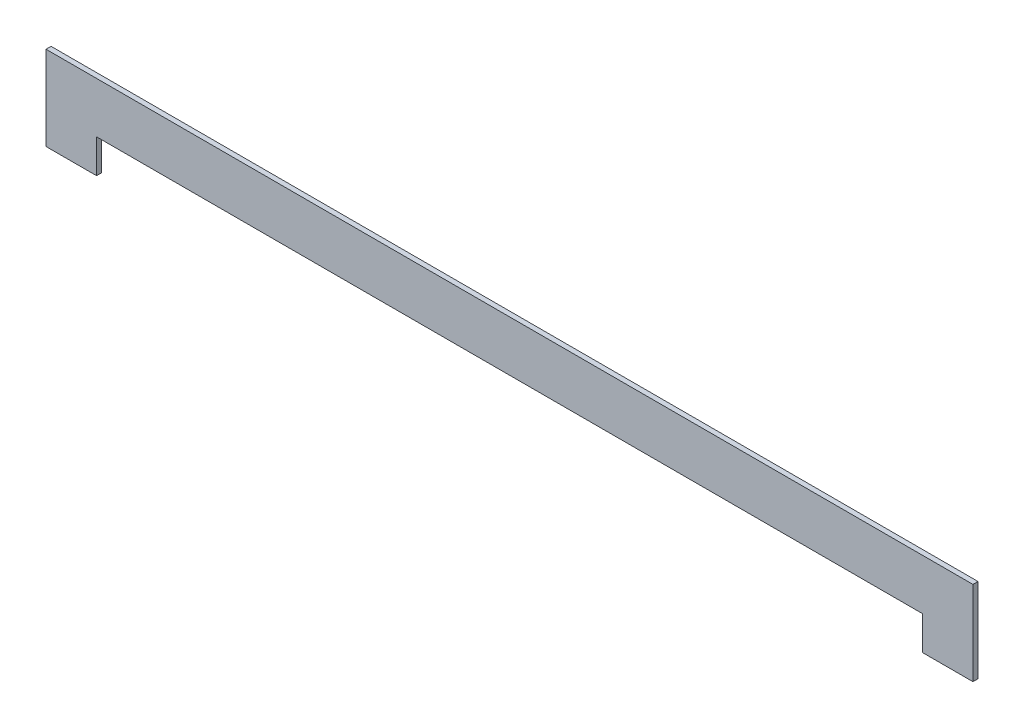
ISO-10303-21;
HEADER;
FILE_DESCRIPTION(('STEP AP214'),'2;1');
FILE_NAME('part.step','',(''),(''),'','','');
FILE_SCHEMA(('AUTOMOTIVE_DESIGN { 1 0 10303 214 1 1 1 1 }'));
ENDSEC;
DATA;
#1=APPLICATION_CONTEXT('core data for automotive mechanical design processes');
#2=APPLICATION_PROTOCOL_DEFINITION('international standard','automotive_design',2000,#1);
#3=PRODUCT_CONTEXT('',#1,'mechanical');
#4=PRODUCT('Part','Part','',(#3));
#5=PRODUCT_RELATED_PRODUCT_CATEGORY('part','',(#4));
#6=PRODUCT_DEFINITION_FORMATION('','',#4);
#7=PRODUCT_DEFINITION_CONTEXT('part definition',#1,'design');
#8=PRODUCT_DEFINITION('design','',#6,#7);
#9=PRODUCT_DEFINITION_SHAPE('','',#8);
#10=(LENGTH_UNIT() NAMED_UNIT(*) SI_UNIT(.MILLI.,.METRE.));
#11=(NAMED_UNIT(*) PLANE_ANGLE_UNIT() SI_UNIT($,.RADIAN.));
#12=(NAMED_UNIT(*) SI_UNIT($,.STERADIAN.) SOLID_ANGLE_UNIT());
#13=UNCERTAINTY_MEASURE_WITH_UNIT(LENGTH_MEASURE(1.E-05),#10,'distance_accuracy_value','');
#14=(GEOMETRIC_REPRESENTATION_CONTEXT(3) GLOBAL_UNCERTAINTY_ASSIGNED_CONTEXT((#13)) GLOBAL_UNIT_ASSIGNED_CONTEXT((#10,
#11,#12)) REPRESENTATION_CONTEXT('',''));
#15=CARTESIAN_POINT('',(0.,0.,0.));
#16=DIRECTION('',(0.,0.,1.));
#17=DIRECTION('',(1.,0.,0.));
#18=AXIS2_PLACEMENT_3D('',#15,#16,#17);
#19=CARTESIAN_POINT('',(-275.,-25.,3.));
#20=DIRECTION('',(0.,1.,0.));
#21=DIRECTION('',(-1.,0.,0.));
#22=AXIS2_PLACEMENT_3D('',#19,#20,#21);
#23=PLANE('',#22);
#24=DIRECTION('',(0.,0.,-1.));
#25=VECTOR('',#24,1.);
#26=CARTESIAN_POINT('',(-245.,-25.,3.));
#27=LINE('',#26,#25);
#28=CARTESIAN_POINT('',(-245.,-25.,3.));
#29=VERTEX_POINT('',#28);
#30=CARTESIAN_POINT('',(-245.,-25.,0.));
#31=VERTEX_POINT('',#30);
#32=EDGE_CURVE('E111',#29,#31,#27,.T.);
#33=ORIENTED_EDGE('',*,*,#32,.F.);
#34=DIRECTION('',(1.,0.,0.));
#35=VECTOR('',#34,1.);
#36=CARTESIAN_POINT('',(-275.,-25.,3.));
#37=LINE('',#36,#35);
#38=CARTESIAN_POINT('',(-275.,-25.,3.));
#39=VERTEX_POINT('',#38);
#40=EDGE_CURVE('E87',#39,#29,#37,.T.);
#41=ORIENTED_EDGE('',*,*,#40,.F.);
#42=DIRECTION('',(0.,0.,-1.));
#43=VECTOR('',#42,1.);
#44=CARTESIAN_POINT('',(-275.,-25.,3.));
#45=LINE('',#44,#43);
#46=CARTESIAN_POINT('',(-275.,-25.,0.));
#47=VERTEX_POINT('',#46);
#48=EDGE_CURVE('E11',#39,#47,#45,.T.);
#49=ORIENTED_EDGE('',*,*,#48,.T.);
#50=DIRECTION('',(1.,0.,0.));
#51=VECTOR('',#50,1.);
#52=CARTESIAN_POINT('',(-275.,-25.,0.));
#53=LINE('',#52,#51);
#54=EDGE_CURVE('E118',#47,#31,#53,.T.);
#55=ORIENTED_EDGE('',*,*,#54,.T.);
#56=EDGE_LOOP('',(#33,#41,#49,#55));
#57=FACE_BOUND('',#56,.T.);
#58=ADVANCED_FACE('F35',(#57),#23,.F.);
#59=DIRECTION('',(0.,0.,-1.));
#60=VECTOR('',#59,1.);
#61=CARTESIAN_POINT('',(245.,-25.,3.));
#62=LINE('',#61,#60);
#63=CARTESIAN_POINT('',(245.,-25.,3.));
#64=VERTEX_POINT('',#63);
#65=CARTESIAN_POINT('',(245.,-25.,0.));
#66=VERTEX_POINT('',#65);
#67=EDGE_CURVE('E120',#64,#66,#62,.T.);
#68=ORIENTED_EDGE('',*,*,#67,.T.);
#69=CARTESIAN_POINT('',(275.,-25.,0.));
#70=VERTEX_POINT('',#69);
#71=EDGE_CURVE('E136',#66,#70,#53,.T.);
#72=ORIENTED_EDGE('',*,*,#71,.T.);
#73=DIRECTION('',(0.,0.,-1.));
#74=VECTOR('',#73,1.);
#75=CARTESIAN_POINT('',(275.,-25.,3.));
#76=LINE('',#75,#74);
#77=CARTESIAN_POINT('',(275.,-25.,3.));
#78=VERTEX_POINT('',#77);
#79=EDGE_CURVE('E43',#78,#70,#76,.T.);
#80=ORIENTED_EDGE('',*,*,#79,.F.);
#81=EDGE_CURVE('E127',#64,#78,#37,.T.);
#82=ORIENTED_EDGE('',*,*,#81,.F.);
#83=EDGE_LOOP('',(#68,#72,#80,#82));
#84=FACE_BOUND('',#83,.T.);
#85=ADVANCED_FACE('F170',(#84),#23,.F.);
#86=CARTESIAN_POINT('',(0.,0.,3.));
#87=DIRECTION('',(0.,0.,1.));
#88=DIRECTION('',(1.,0.,0.));
#89=AXIS2_PLACEMENT_3D('',#86,#87,#88);
#90=PLANE('',#89);
#91=ORIENTED_EDGE('',*,*,#40,.T.);
#92=DIRECTION('',(0.,-1.,0.));
#93=VECTOR('',#92,1.);
#94=CARTESIAN_POINT('',(-245.,-25.,3.));
#95=LINE('',#94,#93);
#96=CARTESIAN_POINT('',(-245.,-4.99999999999998,3.));
#97=VERTEX_POINT('',#96);
#98=EDGE_CURVE('E109',#97,#29,#95,.T.);
#99=ORIENTED_EDGE('',*,*,#98,.F.);
#100=DIRECTION('',(-1.,0.,0.));
#101=VECTOR('',#100,1.);
#102=CARTESIAN_POINT('',(-245.,-4.99999999999998,3.));
#103=LINE('',#102,#101);
#104=CARTESIAN_POINT('',(245.,-4.99999999999992,3.));
#105=VERTEX_POINT('',#104);
#106=EDGE_CURVE('E186',#105,#97,#103,.T.);
#107=ORIENTED_EDGE('',*,*,#106,.F.);
#108=DIRECTION('',(0.,1.,0.));
#109=VECTOR('',#108,1.);
#110=CARTESIAN_POINT('',(245.,-25.,3.));
#111=LINE('',#110,#109);
#112=EDGE_CURVE('E114',#64,#105,#111,.T.);
#113=ORIENTED_EDGE('',*,*,#112,.F.);
#114=ORIENTED_EDGE('',*,*,#81,.T.);
#115=DIRECTION('',(0.,1.,0.));
#116=VECTOR('',#115,1.);
#117=CARTESIAN_POINT('',(275.,25.,3.));
#118=LINE('',#117,#116);
#119=CARTESIAN_POINT('',(275.,25.,3.));
#120=VERTEX_POINT('',#119);
#121=EDGE_CURVE('E126',#78,#120,#118,.T.);
#122=ORIENTED_EDGE('',*,*,#121,.T.);
#123=DIRECTION('',(-1.,0.,0.));
#124=VECTOR('',#123,1.);
#125=CARTESIAN_POINT('',(-275.,25.,3.));
#126=LINE('',#125,#124);
#127=CARTESIAN_POINT('',(-275.,25.,3.));
#128=VERTEX_POINT('',#127);
#129=EDGE_CURVE('E59',#120,#128,#126,.T.);
#130=ORIENTED_EDGE('',*,*,#129,.T.);
#131=DIRECTION('',(0.,-1.,0.));
#132=VECTOR('',#131,1.);
#133=CARTESIAN_POINT('',(-275.,25.,3.));
#134=LINE('',#133,#132);
#135=EDGE_CURVE('E124',#128,#39,#134,.T.);
#136=ORIENTED_EDGE('',*,*,#135,.T.);
#137=EDGE_LOOP('',(#91,#99,#107,#113,#114,#122,#130,#136));
#138=FACE_BOUND('',#137,.T.);
#139=ADVANCED_FACE('F122',(#138),#90,.T.);
#140=CARTESIAN_POINT('',(0.,0.,0.));
#141=DIRECTION('',(0.,0.,1.));
#142=DIRECTION('',(1.,0.,0.));
#143=AXIS2_PLACEMENT_3D('',#140,#141,#142);
#144=PLANE('',#143);
#145=DIRECTION('',(0.,-1.,0.));
#146=VECTOR('',#145,1.);
#147=CARTESIAN_POINT('',(-245.,-25.,0.));
#148=LINE('',#147,#146);
#149=CARTESIAN_POINT('',(-245.,-4.99999999999998,0.));
#150=VERTEX_POINT('',#149);
#151=EDGE_CURVE('E50',#150,#31,#148,.T.);
#152=ORIENTED_EDGE('',*,*,#151,.T.);
#153=ORIENTED_EDGE('',*,*,#54,.F.);
#154=DIRECTION('',(0.,-1.,0.));
#155=VECTOR('',#154,1.);
#156=CARTESIAN_POINT('',(-275.,25.,0.));
#157=LINE('',#156,#155);
#158=CARTESIAN_POINT('',(-275.,25.,0.));
#159=VERTEX_POINT('',#158);
#160=EDGE_CURVE('E119',#159,#47,#157,.T.);
#161=ORIENTED_EDGE('',*,*,#160,.F.);
#162=DIRECTION('',(-1.,0.,0.));
#163=VECTOR('',#162,1.);
#164=CARTESIAN_POINT('',(-275.,25.,0.));
#165=LINE('',#164,#163);
#166=CARTESIAN_POINT('',(275.,25.,0.));
#167=VERTEX_POINT('',#166);
#168=EDGE_CURVE('E80',#167,#159,#165,.T.);
#169=ORIENTED_EDGE('',*,*,#168,.F.);
#170=DIRECTION('',(0.,1.,0.));
#171=VECTOR('',#170,1.);
#172=CARTESIAN_POINT('',(275.,25.,0.));
#173=LINE('',#172,#171);
#174=EDGE_CURVE('E138',#70,#167,#173,.T.);
#175=ORIENTED_EDGE('',*,*,#174,.F.);
#176=ORIENTED_EDGE('',*,*,#71,.F.);
#177=DIRECTION('',(0.,1.,0.));
#178=VECTOR('',#177,1.);
#179=CARTESIAN_POINT('',(245.,-25.,0.));
#180=LINE('',#179,#178);
#181=CARTESIAN_POINT('',(245.,-4.99999999999992,0.));
#182=VERTEX_POINT('',#181);
#183=EDGE_CURVE('E189',#66,#182,#180,.T.);
#184=ORIENTED_EDGE('',*,*,#183,.T.);
#185=DIRECTION('',(-1.,0.,0.));
#186=VECTOR('',#185,1.);
#187=CARTESIAN_POINT('',(-245.,-4.99999999999998,0.));
#188=LINE('',#187,#186);
#189=EDGE_CURVE('E115',#182,#150,#188,.T.);
#190=ORIENTED_EDGE('',*,*,#189,.T.);
#191=EDGE_LOOP('',(#152,#153,#161,#169,#175,#176,#184,#190));
#192=FACE_BOUND('',#191,.T.);
#193=ADVANCED_FACE('F154',(#192),#144,.F.);
#194=CARTESIAN_POINT('',(-275.,25.,3.));
#195=DIRECTION('',(1.,0.,0.));
#196=DIRECTION('',(0.,0.,-1.));
#197=AXIS2_PLACEMENT_3D('',#194,#195,#196);
#198=PLANE('',#197);
#199=ORIENTED_EDGE('',*,*,#160,.T.);
#200=ORIENTED_EDGE('',*,*,#48,.F.);
#201=ORIENTED_EDGE('',*,*,#135,.F.);
#202=DIRECTION('',(0.,0.,-1.));
#203=VECTOR('',#202,1.);
#204=CARTESIAN_POINT('',(-275.,25.,3.));
#205=LINE('',#204,#203);
#206=EDGE_CURVE('E133',#128,#159,#205,.T.);
#207=ORIENTED_EDGE('',*,*,#206,.T.);
#208=EDGE_LOOP('',(#199,#200,#201,#207));
#209=FACE_BOUND('',#208,.T.);
#210=ADVANCED_FACE('F37',(#209),#198,.F.);
#211=CARTESIAN_POINT('',(275.,25.,3.));
#212=DIRECTION('',(-1.,0.,0.));
#213=DIRECTION('',(0.,0.,1.));
#214=AXIS2_PLACEMENT_3D('',#211,#212,#213);
#215=PLANE('',#214);
#216=ORIENTED_EDGE('',*,*,#174,.T.);
#217=DIRECTION('',(0.,0.,-1.));
#218=VECTOR('',#217,1.);
#219=CARTESIAN_POINT('',(275.,25.,3.));
#220=LINE('',#219,#218);
#221=EDGE_CURVE('E142',#120,#167,#220,.T.);
#222=ORIENTED_EDGE('',*,*,#221,.F.);
#223=ORIENTED_EDGE('',*,*,#121,.F.);
#224=ORIENTED_EDGE('',*,*,#79,.T.);
#225=EDGE_LOOP('',(#216,#222,#223,#224));
#226=FACE_BOUND('',#225,.T.);
#227=ADVANCED_FACE('F148',(#226),#215,.F.);
#228=CARTESIAN_POINT('',(-275.,25.,3.));
#229=DIRECTION('',(0.,-1.,0.));
#230=DIRECTION('',(0.,0.,-1.));
#231=AXIS2_PLACEMENT_3D('',#228,#229,#230);
#232=PLANE('',#231);
#233=ORIENTED_EDGE('',*,*,#168,.T.);
#234=ORIENTED_EDGE('',*,*,#206,.F.);
#235=ORIENTED_EDGE('',*,*,#129,.F.);
#236=ORIENTED_EDGE('',*,*,#221,.T.);
#237=EDGE_LOOP('',(#233,#234,#235,#236));
#238=FACE_BOUND('',#237,.T.);
#239=ADVANCED_FACE('F158',(#238),#232,.F.);
#240=CARTESIAN_POINT('',(-245.,-25.,3.));
#241=DIRECTION('',(1.,0.,0.));
#242=DIRECTION('',(0.,0.,-1.));
#243=AXIS2_PLACEMENT_3D('',#240,#241,#242);
#244=PLANE('',#243);
#245=ORIENTED_EDGE('',*,*,#151,.F.);
#246=DIRECTION('',(0.,0.,-1.));
#247=VECTOR('',#246,1.);
#248=CARTESIAN_POINT('',(-245.,-4.99999999999998,3.));
#249=LINE('',#248,#247);
#250=EDGE_CURVE('E112',#97,#150,#249,.T.);
#251=ORIENTED_EDGE('',*,*,#250,.F.);
#252=ORIENTED_EDGE('',*,*,#98,.T.);
#253=ORIENTED_EDGE('',*,*,#32,.T.);
#254=EDGE_LOOP('',(#245,#251,#252,#253));
#255=FACE_BOUND('',#254,.T.);
#256=ADVANCED_FACE('F110',(#255),#244,.T.);
#257=CARTESIAN_POINT('',(245.,-25.,3.));
#258=DIRECTION('',(-1.,0.,0.));
#259=DIRECTION('',(0.,0.,1.));
#260=AXIS2_PLACEMENT_3D('',#257,#258,#259);
#261=PLANE('',#260);
#262=ORIENTED_EDGE('',*,*,#183,.F.);
#263=ORIENTED_EDGE('',*,*,#67,.F.);
#264=ORIENTED_EDGE('',*,*,#112,.T.);
#265=DIRECTION('',(0.,0.,-1.));
#266=VECTOR('',#265,1.);
#267=CARTESIAN_POINT('',(245.,-4.99999999999992,3.));
#268=LINE('',#267,#266);
#269=EDGE_CURVE('E181',#105,#182,#268,.T.);
#270=ORIENTED_EDGE('',*,*,#269,.T.);
#271=EDGE_LOOP('',(#262,#263,#264,#270));
#272=FACE_BOUND('',#271,.T.);
#273=ADVANCED_FACE('F165',(#272),#261,.T.);
#274=CARTESIAN_POINT('',(-245.,-4.99999999999998,3.));
#275=DIRECTION('',(0.,-1.,0.));
#276=DIRECTION('',(1.,0.,0.));
#277=AXIS2_PLACEMENT_3D('',#274,#275,#276);
#278=PLANE('',#277);
#279=ORIENTED_EDGE('',*,*,#189,.F.);
#280=ORIENTED_EDGE('',*,*,#269,.F.);
#281=ORIENTED_EDGE('',*,*,#106,.T.);
#282=ORIENTED_EDGE('',*,*,#250,.T.);
#283=EDGE_LOOP('',(#279,#280,#281,#282));
#284=FACE_BOUND('',#283,.T.);
#285=ADVANCED_FACE('F196',(#284),#278,.T.);
#286=CLOSED_SHELL('',(#58,#85,#139,#193,#210,#227,#239,#256,#273,#285));
#287=MANIFOLD_SOLID_BREP('B2',#286);
#288=ADVANCED_BREP_SHAPE_REPRESENTATION('',(#18,#287),#14);
#289=SHAPE_DEFINITION_REPRESENTATION(#9,#288);
ENDSEC;
END-ISO-10303-21;
